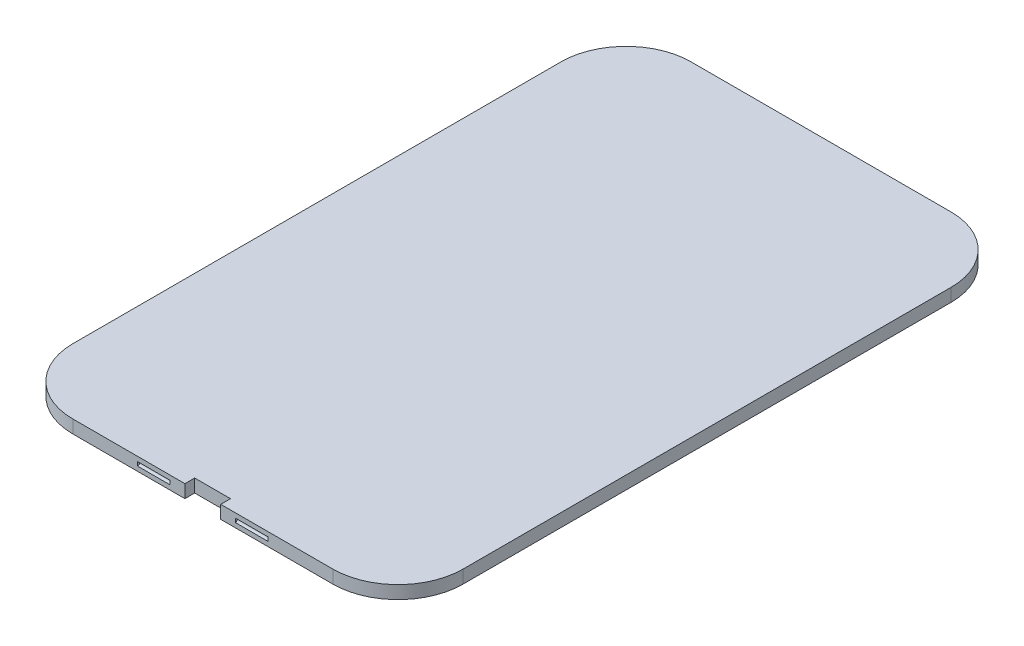
ISO-10303-21;
HEADER;
FILE_DESCRIPTION(('STEP AP214'),'2;1');
FILE_NAME('part.step','',(''),(''),'','','');
FILE_SCHEMA(('AUTOMOTIVE_DESIGN { 1 0 10303 214 1 1 1 1 }'));
ENDSEC;
DATA;
#1=APPLICATION_CONTEXT('core data for automotive mechanical design processes');
#2=APPLICATION_PROTOCOL_DEFINITION('international standard','automotive_design',2000,#1);
#3=PRODUCT_CONTEXT('',#1,'mechanical');
#4=PRODUCT('Part','Part','',(#3));
#5=PRODUCT_RELATED_PRODUCT_CATEGORY('part','',(#4));
#6=PRODUCT_DEFINITION_FORMATION('','',#4);
#7=PRODUCT_DEFINITION_CONTEXT('part definition',#1,'design');
#8=PRODUCT_DEFINITION('design','',#6,#7);
#9=PRODUCT_DEFINITION_SHAPE('','',#8);
#10=(LENGTH_UNIT() NAMED_UNIT(*) SI_UNIT(.MILLI.,.METRE.));
#11=(NAMED_UNIT(*) PLANE_ANGLE_UNIT() SI_UNIT($,.RADIAN.));
#12=(NAMED_UNIT(*) SI_UNIT($,.STERADIAN.) SOLID_ANGLE_UNIT());
#13=UNCERTAINTY_MEASURE_WITH_UNIT(LENGTH_MEASURE(1.E-05),#10,'distance_accuracy_value','');
#14=(GEOMETRIC_REPRESENTATION_CONTEXT(3) GLOBAL_UNCERTAINTY_ASSIGNED_CONTEXT((#13)) GLOBAL_UNIT_ASSIGNED_CONTEXT((#10,
#11,#12)) REPRESENTATION_CONTEXT('',''));
#15=CARTESIAN_POINT('',(0.,0.,0.));
#16=DIRECTION('',(0.,0.,1.));
#17=DIRECTION('',(1.,0.,0.));
#18=AXIS2_PLACEMENT_3D('',#15,#16,#17);
#19=CARTESIAN_POINT('',(-25.3365,2.54,60.2615));
#20=DIRECTION('',(0.,0.,-1.));
#21=DIRECTION('',(-1.,0.,0.));
#22=AXIS2_PLACEMENT_3D('',#19,#20,#21);
#23=PLANE('',#22);
#24=DIRECTION('',(1.,0.,0.));
#25=VECTOR('',#24,1.);
#26=CARTESIAN_POINT('',(-12.7,0.888999999999998,60.2615));
#27=LINE('',#26,#25);
#28=CARTESIAN_POINT('',(-12.7,0.888999999999998,60.2615));
#29=VERTEX_POINT('',#28);
#30=CARTESIAN_POINT('',(-6.35,0.889,60.2615));
#31=VERTEX_POINT('',#30);
#32=EDGE_CURVE('E263',#29,#31,#27,.T.);
#33=ORIENTED_EDGE('',*,*,#32,.F.);
#34=DIRECTION('',(0.,-1.,0.));
#35=VECTOR('',#34,1.);
#36=CARTESIAN_POINT('',(-12.7,1.651,60.2615));
#37=LINE('',#36,#35);
#38=CARTESIAN_POINT('',(-12.7,1.651,60.2615));
#39=VERTEX_POINT('',#38);
#40=EDGE_CURVE('E258',#39,#29,#37,.T.);
#41=ORIENTED_EDGE('',*,*,#40,.F.);
#42=DIRECTION('',(-1.,0.,0.));
#43=VECTOR('',#42,1.);
#44=CARTESIAN_POINT('',(-12.7,1.651,60.2615));
#45=LINE('',#44,#43);
#46=CARTESIAN_POINT('',(-6.35,1.651,60.2615));
#47=VERTEX_POINT('',#46);
#48=EDGE_CURVE('E255',#47,#39,#45,.T.);
#49=ORIENTED_EDGE('',*,*,#48,.F.);
#50=DIRECTION('',(0.,1.,0.));
#51=VECTOR('',#50,1.);
#52=CARTESIAN_POINT('',(-6.35,1.651,60.2615));
#53=LINE('',#52,#51);
#54=EDGE_CURVE('E265',#31,#47,#53,.T.);
#55=ORIENTED_EDGE('',*,*,#54,.F.);
#56=EDGE_LOOP('',(#33,#41,#49,#55));
#57=FACE_BOUND('',#56,.T.);
#58=DIRECTION('',(1.,0.,0.));
#59=VECTOR('',#58,1.);
#60=CARTESIAN_POINT('',(-25.3365,0.,60.2615));
#61=LINE('',#60,#59);
#62=CARTESIAN_POINT('',(-25.3365,0.,60.2615));
#63=VERTEX_POINT('',#62);
#64=CARTESIAN_POINT('',(-3.4925,0.,60.2615));
#65=VERTEX_POINT('',#64);
#66=EDGE_CURVE('E392',#63,#65,#61,.T.);
#67=ORIENTED_EDGE('',*,*,#66,.T.);
#68=DIRECTION('',(0.,1.,0.));
#69=VECTOR('',#68,1.);
#70=CARTESIAN_POINT('',(-3.4925,0.,60.2615));
#71=LINE('',#70,#69);
#72=CARTESIAN_POINT('',(-3.4925,2.54,60.2615));
#73=VERTEX_POINT('',#72);
#74=EDGE_CURVE('E282',#65,#73,#71,.T.);
#75=ORIENTED_EDGE('',*,*,#74,.T.);
#76=DIRECTION('',(1.,0.,0.));
#77=VECTOR('',#76,1.);
#78=CARTESIAN_POINT('',(-25.3365,2.54,60.2615));
#79=LINE('',#78,#77);
#80=CARTESIAN_POINT('',(-25.3365,2.54,60.2615));
#81=VERTEX_POINT('',#80);
#82=EDGE_CURVE('E373',#81,#73,#79,.T.);
#83=ORIENTED_EDGE('',*,*,#82,.F.);
#84=DIRECTION('',(0.,-1.,0.));
#85=VECTOR('',#84,1.);
#86=CARTESIAN_POINT('',(-25.3365,2.54,60.2615));
#87=LINE('',#86,#85);
#88=EDGE_CURVE('E419',#81,#63,#87,.T.);
#89=ORIENTED_EDGE('',*,*,#88,.T.);
#90=EDGE_LOOP('',(#67,#75,#83,#89));
#91=FACE_BOUND('',#90,.T.);
#92=ADVANCED_FACE('F32',(#57,#91),#23,.F.);
#93=CARTESIAN_POINT('',(-25.3365,2.54,-60.2615));
#94=DIRECTION('',(0.,0.,1.));
#95=DIRECTION('',(1.,0.,0.));
#96=AXIS2_PLACEMENT_3D('',#93,#94,#95);
#97=PLANE('',#96);
#98=DIRECTION('',(0.,1.,0.));
#99=VECTOR('',#98,1.);
#100=CARTESIAN_POINT('',(-18.923,0.,-60.2615));
#101=LINE('',#100,#99);
#102=CARTESIAN_POINT('',(-18.923,0.,-60.2615));
#103=VERTEX_POINT('',#102);
#104=CARTESIAN_POINT('',(-18.923,1.27,-60.2615));
#105=VERTEX_POINT('',#104);
#106=EDGE_CURVE('E291',#103,#105,#101,.T.);
#107=ORIENTED_EDGE('',*,*,#106,.F.);
#108=DIRECTION('',(-1.,0.,0.));
#109=VECTOR('',#108,1.);
#110=CARTESIAN_POINT('',(-25.3365,0.,-60.2615));
#111=LINE('',#110,#109);
#112=CARTESIAN_POINT('',(-25.3365,0.,-60.2615));
#113=VERTEX_POINT('',#112);
#114=EDGE_CURVE('E401',#103,#113,#111,.T.);
#115=ORIENTED_EDGE('',*,*,#114,.T.);
#116=DIRECTION('',(0.,-1.,0.));
#117=VECTOR('',#116,1.);
#118=CARTESIAN_POINT('',(-25.3365,2.54,-60.2615));
#119=LINE('',#118,#117);
#120=CARTESIAN_POINT('',(-25.3365,2.54,-60.2615));
#121=VERTEX_POINT('',#120);
#122=EDGE_CURVE('E384',#121,#113,#119,.T.);
#123=ORIENTED_EDGE('',*,*,#122,.F.);
#124=DIRECTION('',(-1.,0.,0.));
#125=VECTOR('',#124,1.);
#126=CARTESIAN_POINT('',(-25.3365,2.54,-60.2615));
#127=LINE('',#126,#125);
#128=CARTESIAN_POINT('',(25.3365,2.54,-60.2615));
#129=VERTEX_POINT('',#128);
#130=EDGE_CURVE('E382',#129,#121,#127,.T.);
#131=ORIENTED_EDGE('',*,*,#130,.F.);
#132=DIRECTION('',(0.,-1.,0.));
#133=VECTOR('',#132,1.);
#134=CARTESIAN_POINT('',(25.3365,2.54,-60.2615));
#135=LINE('',#134,#133);
#136=CARTESIAN_POINT('',(25.3365,0.,-60.2615));
#137=VERTEX_POINT('',#136);
#138=EDGE_CURVE('E407',#129,#137,#135,.T.);
#139=ORIENTED_EDGE('',*,*,#138,.T.);
#140=CARTESIAN_POINT('',(18.923,0.,-60.2615));
#141=VERTEX_POINT('',#140);
#142=EDGE_CURVE('E368',#137,#141,#111,.T.);
#143=ORIENTED_EDGE('',*,*,#142,.T.);
#144=DIRECTION('',(0.,-1.,0.));
#145=VECTOR('',#144,1.);
#146=CARTESIAN_POINT('',(18.923,0.,-60.2615));
#147=LINE('',#146,#145);
#148=CARTESIAN_POINT('',(18.923,1.27,-60.2615));
#149=VERTEX_POINT('',#148);
#150=EDGE_CURVE('E313',#149,#141,#147,.T.);
#151=ORIENTED_EDGE('',*,*,#150,.F.);
#152=DIRECTION('',(1.,0.,0.));
#153=VECTOR('',#152,1.);
#154=CARTESIAN_POINT('',(18.923,1.27,-60.2615));
#155=LINE('',#154,#153);
#156=CARTESIAN_POINT('',(6.477,1.27,-60.2615));
#157=VERTEX_POINT('',#156);
#158=EDGE_CURVE('E339',#157,#149,#155,.T.);
#159=ORIENTED_EDGE('',*,*,#158,.F.);
#160=DIRECTION('',(0.,1.,0.));
#161=VECTOR('',#160,1.);
#162=CARTESIAN_POINT('',(6.477,0.,-60.2615));
#163=LINE('',#162,#161);
#164=CARTESIAN_POINT('',(6.477,0.,-60.2615));
#165=VERTEX_POINT('',#164);
#166=EDGE_CURVE('E336',#165,#157,#163,.T.);
#167=ORIENTED_EDGE('',*,*,#166,.F.);
#168=CARTESIAN_POINT('',(-6.47700000000001,0.,-60.2615));
#169=VERTEX_POINT('',#168);
#170=EDGE_CURVE('E404',#165,#169,#111,.T.);
#171=ORIENTED_EDGE('',*,*,#170,.T.);
#172=DIRECTION('',(0.,-1.,0.));
#173=VECTOR('',#172,1.);
#174=CARTESIAN_POINT('',(-6.477,0.,-60.2615));
#175=LINE('',#174,#173);
#176=CARTESIAN_POINT('',(-6.477,1.27,-60.2615));
#177=VERTEX_POINT('',#176);
#178=EDGE_CURVE('E303',#177,#169,#175,.T.);
#179=ORIENTED_EDGE('',*,*,#178,.F.);
#180=DIRECTION('',(1.,0.,0.));
#181=VECTOR('',#180,1.);
#182=CARTESIAN_POINT('',(-18.923,1.27,-60.2615));
#183=LINE('',#182,#181);
#184=EDGE_CURVE('E300',#105,#177,#183,.T.);
#185=ORIENTED_EDGE('',*,*,#184,.F.);
#186=EDGE_LOOP('',(#107,#115,#123,#131,#139,#143,#151,#159,#167,#171,#179,#185));
#187=FACE_BOUND('',#186,.T.);
#188=ADVANCED_FACE('F448',(#187),#97,.F.);
#189=CARTESIAN_POINT('',(-25.3365,2.54,-47.5615));
#190=DIRECTION('',(0.,-1.,0.));
#191=DIRECTION('',(0.,0.,-1.));
#192=AXIS2_PLACEMENT_3D('',#189,#190,#191);
#193=CYLINDRICAL_SURFACE('',#192,12.7);
#194=CARTESIAN_POINT('',(-25.3365,0.,-47.5615));
#195=DIRECTION('',(0.,1.,0.));
#196=DIRECTION('',(0.,0.,-1.));
#197=AXIS2_PLACEMENT_3D('',#194,#195,#196);
#198=CIRCLE('',#197,12.7);
#199=CARTESIAN_POINT('',(-38.0365,0.,-47.5615));
#200=VERTEX_POINT('',#199);
#201=EDGE_CURVE('E346',#113,#200,#198,.T.);
#202=ORIENTED_EDGE('',*,*,#201,.T.);
#203=DIRECTION('',(0.,-1.,0.));
#204=VECTOR('',#203,1.);
#205=CARTESIAN_POINT('',(-38.0365,2.54,-47.5615));
#206=LINE('',#205,#204);
#207=CARTESIAN_POINT('',(-38.0365,2.54,-47.5615));
#208=VERTEX_POINT('',#207);
#209=EDGE_CURVE('E230',#208,#200,#206,.T.);
#210=ORIENTED_EDGE('',*,*,#209,.F.);
#211=CARTESIAN_POINT('',(-25.3365,2.54,-47.5615));
#212=DIRECTION('',(0.,1.,0.));
#213=DIRECTION('',(0.,0.,-1.));
#214=AXIS2_PLACEMENT_3D('',#211,#212,#213);
#215=CIRCLE('',#214,12.7);
#216=EDGE_CURVE('E364',#121,#208,#215,.T.);
#217=ORIENTED_EDGE('',*,*,#216,.F.);
#218=ORIENTED_EDGE('',*,*,#122,.T.);
#219=EDGE_LOOP('',(#202,#210,#217,#218));
#220=FACE_BOUND('',#219,.T.);
#221=ADVANCED_FACE('F443',(#220),#193,.T.);
#222=CARTESIAN_POINT('',(-38.0365,2.54,47.5615));
#223=DIRECTION('',(1.,0.,0.));
#224=DIRECTION('',(0.,0.,-1.));
#225=AXIS2_PLACEMENT_3D('',#222,#223,#224);
#226=PLANE('',#225);
#227=DIRECTION('',(0.,0.,1.));
#228=VECTOR('',#227,1.);
#229=CARTESIAN_POINT('',(-38.0365,0.,47.5615));
#230=LINE('',#229,#228);
#231=CARTESIAN_POINT('',(-38.0365,0.,47.5615));
#232=VERTEX_POINT('',#231);
#233=EDGE_CURVE('E387',#200,#232,#230,.T.);
#234=ORIENTED_EDGE('',*,*,#233,.T.);
#235=DIRECTION('',(0.,-1.,0.));
#236=VECTOR('',#235,1.);
#237=CARTESIAN_POINT('',(-38.0365,2.54,47.5615));
#238=LINE('',#237,#236);
#239=CARTESIAN_POINT('',(-38.0365,2.54,47.5615));
#240=VERTEX_POINT('',#239);
#241=EDGE_CURVE('E235',#240,#232,#238,.T.);
#242=ORIENTED_EDGE('',*,*,#241,.F.);
#243=DIRECTION('',(0.,0.,1.));
#244=VECTOR('',#243,1.);
#245=CARTESIAN_POINT('',(-38.0365,2.54,47.5615));
#246=LINE('',#245,#244);
#247=EDGE_CURVE('E367',#208,#240,#246,.T.);
#248=ORIENTED_EDGE('',*,*,#247,.F.);
#249=ORIENTED_EDGE('',*,*,#209,.T.);
#250=EDGE_LOOP('',(#234,#242,#248,#249));
#251=FACE_BOUND('',#250,.T.);
#252=ADVANCED_FACE('F441',(#251),#226,.F.);
#253=CARTESIAN_POINT('',(-25.3365,2.54,47.5615));
#254=DIRECTION('',(0.,-1.,0.));
#255=DIRECTION('',(0.,0.,-1.));
#256=AXIS2_PLACEMENT_3D('',#253,#254,#255);
#257=CYLINDRICAL_SURFACE('',#256,12.7);
#258=CARTESIAN_POINT('',(-25.3365,0.,47.5615));
#259=DIRECTION('',(0.,1.,0.));
#260=DIRECTION('',(0.,0.,1.));
#261=AXIS2_PLACEMENT_3D('',#258,#259,#260);
#262=CIRCLE('',#261,12.7);
#263=EDGE_CURVE('E389',#232,#63,#262,.T.);
#264=ORIENTED_EDGE('',*,*,#263,.T.);
#265=ORIENTED_EDGE('',*,*,#88,.F.);
#266=CARTESIAN_POINT('',(-25.3365,2.54,47.5615));
#267=DIRECTION('',(0.,1.,0.));
#268=DIRECTION('',(0.,0.,1.));
#269=AXIS2_PLACEMENT_3D('',#266,#267,#268);
#270=CIRCLE('',#269,12.7);
#271=EDGE_CURVE('E370',#240,#81,#270,.T.);
#272=ORIENTED_EDGE('',*,*,#271,.F.);
#273=ORIENTED_EDGE('',*,*,#241,.T.);
#274=EDGE_LOOP('',(#264,#265,#272,#273));
#275=FACE_BOUND('',#274,.T.);
#276=ADVANCED_FACE('F426',(#275),#257,.T.);
#277=DIRECTION('',(0.,-1.,0.));
#278=VECTOR('',#277,1.);
#279=CARTESIAN_POINT('',(6.35,1.651,60.2615));
#280=LINE('',#279,#278);
#281=CARTESIAN_POINT('',(6.35,1.651,60.2615));
#282=VERTEX_POINT('',#281);
#283=CARTESIAN_POINT('',(6.35,0.889000000000003,60.2615));
#284=VERTEX_POINT('',#283);
#285=EDGE_CURVE('E204',#282,#284,#280,.T.);
#286=ORIENTED_EDGE('',*,*,#285,.F.);
#287=DIRECTION('',(-1.,0.,0.));
#288=VECTOR('',#287,1.);
#289=CARTESIAN_POINT('',(12.7,1.651,60.2615));
#290=LINE('',#289,#288);
#291=CARTESIAN_POINT('',(12.7,1.651,60.2615));
#292=VERTEX_POINT('',#291);
#293=EDGE_CURVE('E216',#292,#282,#290,.T.);
#294=ORIENTED_EDGE('',*,*,#293,.F.);
#295=DIRECTION('',(0.,1.,0.));
#296=VECTOR('',#295,1.);
#297=CARTESIAN_POINT('',(12.7,1.651,60.2615));
#298=LINE('',#297,#296);
#299=CARTESIAN_POINT('',(12.7,0.889000000000004,60.2615));
#300=VERTEX_POINT('',#299);
#301=EDGE_CURVE('E223',#300,#292,#298,.T.);
#302=ORIENTED_EDGE('',*,*,#301,.F.);
#303=DIRECTION('',(1.,0.,0.));
#304=VECTOR('',#303,1.);
#305=CARTESIAN_POINT('',(12.7,0.889000000000004,60.2615));
#306=LINE('',#305,#304);
#307=EDGE_CURVE('E215',#284,#300,#306,.T.);
#308=ORIENTED_EDGE('',*,*,#307,.F.);
#309=EDGE_LOOP('',(#286,#294,#302,#308));
#310=FACE_BOUND('',#309,.T.);
#311=CARTESIAN_POINT('',(3.4925,2.54,60.2615));
#312=VERTEX_POINT('',#311);
#313=CARTESIAN_POINT('',(25.3365,2.54,60.2615));
#314=VERTEX_POINT('',#313);
#315=EDGE_CURVE('E372',#312,#314,#79,.T.);
#316=ORIENTED_EDGE('',*,*,#315,.F.);
#317=DIRECTION('',(0.,1.,0.));
#318=VECTOR('',#317,1.);
#319=CARTESIAN_POINT('',(3.4925,0.,60.2615));
#320=LINE('',#319,#318);
#321=CARTESIAN_POINT('',(3.4925,0.,60.2615));
#322=VERTEX_POINT('',#321);
#323=EDGE_CURVE('E294',#322,#312,#320,.T.);
#324=ORIENTED_EDGE('',*,*,#323,.F.);
#325=CARTESIAN_POINT('',(25.3365,0.,60.2615));
#326=VERTEX_POINT('',#325);
#327=EDGE_CURVE('E391',#322,#326,#61,.T.);
#328=ORIENTED_EDGE('',*,*,#327,.T.);
#329=DIRECTION('',(0.,-1.,0.));
#330=VECTOR('',#329,1.);
#331=CARTESIAN_POINT('',(25.3365,2.54,60.2615));
#332=LINE('',#331,#330);
#333=EDGE_CURVE('E416',#314,#326,#332,.T.);
#334=ORIENTED_EDGE('',*,*,#333,.F.);
#335=EDGE_LOOP('',(#316,#324,#328,#334));
#336=FACE_BOUND('',#335,.T.);
#337=ADVANCED_FACE('F220',(#310,#336),#23,.F.);
#338=CARTESIAN_POINT('',(25.3365,2.54,47.5615));
#339=DIRECTION('',(0.,-1.,0.));
#340=DIRECTION('',(0.,0.,-1.));
#341=AXIS2_PLACEMENT_3D('',#338,#339,#340);
#342=CYLINDRICAL_SURFACE('',#341,12.7);
#343=CARTESIAN_POINT('',(25.3365,0.,47.5615));
#344=DIRECTION('',(0.,1.,0.));
#345=DIRECTION('',(0.,0.,1.));
#346=AXIS2_PLACEMENT_3D('',#343,#344,#345);
#347=CIRCLE('',#346,12.7);
#348=CARTESIAN_POINT('',(38.0365,0.,47.5615));
#349=VERTEX_POINT('',#348);
#350=EDGE_CURVE('E395',#326,#349,#347,.T.);
#351=ORIENTED_EDGE('',*,*,#350,.T.);
#352=DIRECTION('',(0.,-1.,0.));
#353=VECTOR('',#352,1.);
#354=CARTESIAN_POINT('',(38.0365,2.54,47.5615));
#355=LINE('',#354,#353);
#356=CARTESIAN_POINT('',(38.0365,2.54,47.5615));
#357=VERTEX_POINT('',#356);
#358=EDGE_CURVE('E413',#357,#349,#355,.T.);
#359=ORIENTED_EDGE('',*,*,#358,.F.);
#360=CARTESIAN_POINT('',(25.3365,2.54,47.5615));
#361=DIRECTION('',(0.,1.,0.));
#362=DIRECTION('',(0.,0.,1.));
#363=AXIS2_PLACEMENT_3D('',#360,#361,#362);
#364=CIRCLE('',#363,12.7);
#365=EDGE_CURVE('E376',#314,#357,#364,.T.);
#366=ORIENTED_EDGE('',*,*,#365,.F.);
#367=ORIENTED_EDGE('',*,*,#333,.T.);
#368=EDGE_LOOP('',(#351,#359,#366,#367));
#369=FACE_BOUND('',#368,.T.);
#370=ADVANCED_FACE('F486',(#369),#342,.T.);
#371=CARTESIAN_POINT('',(38.0365,2.54,47.5615));
#372=DIRECTION('',(-1.,0.,0.));
#373=DIRECTION('',(0.,0.,1.));
#374=AXIS2_PLACEMENT_3D('',#371,#372,#373);
#375=PLANE('',#374);
#376=DIRECTION('',(0.,0.,-1.));
#377=VECTOR('',#376,1.);
#378=CARTESIAN_POINT('',(38.0365,0.,47.5615));
#379=LINE('',#378,#377);
#380=CARTESIAN_POINT('',(38.0365,0.,-47.5615));
#381=VERTEX_POINT('',#380);
#382=EDGE_CURVE('E397',#349,#381,#379,.T.);
#383=ORIENTED_EDGE('',*,*,#382,.T.);
#384=DIRECTION('',(0.,-1.,0.));
#385=VECTOR('',#384,1.);
#386=CARTESIAN_POINT('',(38.0365,2.54,-47.5615));
#387=LINE('',#386,#385);
#388=CARTESIAN_POINT('',(38.0365,2.54,-47.5615));
#389=VERTEX_POINT('',#388);
#390=EDGE_CURVE('E410',#389,#381,#387,.T.);
#391=ORIENTED_EDGE('',*,*,#390,.F.);
#392=DIRECTION('',(0.,0.,-1.));
#393=VECTOR('',#392,1.);
#394=CARTESIAN_POINT('',(38.0365,2.54,47.5615));
#395=LINE('',#394,#393);
#396=EDGE_CURVE('E378',#357,#389,#395,.T.);
#397=ORIENTED_EDGE('',*,*,#396,.F.);
#398=ORIENTED_EDGE('',*,*,#358,.T.);
#399=EDGE_LOOP('',(#383,#391,#397,#398));
#400=FACE_BOUND('',#399,.T.);
#401=ADVANCED_FACE('F491',(#400),#375,.F.);
#402=CARTESIAN_POINT('',(25.3365,2.54,-47.5615));
#403=DIRECTION('',(0.,-1.,0.));
#404=DIRECTION('',(0.,0.,-1.));
#405=AXIS2_PLACEMENT_3D('',#402,#403,#404);
#406=CYLINDRICAL_SURFACE('',#405,12.7);
#407=CARTESIAN_POINT('',(25.3365,0.,-47.5615));
#408=DIRECTION('',(0.,1.,0.));
#409=DIRECTION('',(0.,0.,1.));
#410=AXIS2_PLACEMENT_3D('',#407,#408,#409);
#411=CIRCLE('',#410,12.7);
#412=EDGE_CURVE('E399',#381,#137,#411,.T.);
#413=ORIENTED_EDGE('',*,*,#412,.T.);
#414=ORIENTED_EDGE('',*,*,#138,.F.);
#415=CARTESIAN_POINT('',(25.3365,2.54,-47.5615));
#416=DIRECTION('',(0.,1.,0.));
#417=DIRECTION('',(0.,0.,1.));
#418=AXIS2_PLACEMENT_3D('',#415,#416,#417);
#419=CIRCLE('',#418,12.7);
#420=EDGE_CURVE('E380',#389,#129,#419,.T.);
#421=ORIENTED_EDGE('',*,*,#420,.F.);
#422=ORIENTED_EDGE('',*,*,#390,.T.);
#423=EDGE_LOOP('',(#413,#414,#421,#422));
#424=FACE_BOUND('',#423,.T.);
#425=ADVANCED_FACE('F658',(#424),#406,.T.);
#426=CARTESIAN_POINT('',(-25.3365,2.54,-47.5615));
#427=DIRECTION('',(0.,-1.,0.));
#428=DIRECTION('',(0.,0.,-1.));
#429=AXIS2_PLACEMENT_3D('',#426,#427,#428);
#430=PLANE('',#429);
#431=ORIENTED_EDGE('',*,*,#82,.T.);
#432=DIRECTION('',(0.,0.,1.));
#433=VECTOR('',#432,1.);
#434=CARTESIAN_POINT('',(-3.4925,2.54,60.2615));
#435=LINE('',#434,#433);
#436=CARTESIAN_POINT('',(-3.4925,2.54,58.3565));
#437=VERTEX_POINT('',#436);
#438=EDGE_CURVE('E271',#437,#73,#435,.T.);
#439=ORIENTED_EDGE('',*,*,#438,.F.);
#440=DIRECTION('',(-1.,0.,0.));
#441=VECTOR('',#440,1.);
#442=CARTESIAN_POINT('',(-3.4925,2.54,58.3565));
#443=LINE('',#442,#441);
#444=CARTESIAN_POINT('',(3.4925,2.54,58.3565));
#445=VERTEX_POINT('',#444);
#446=EDGE_CURVE('E276',#445,#437,#443,.T.);
#447=ORIENTED_EDGE('',*,*,#446,.F.);
#448=DIRECTION('',(0.,0.,-1.));
#449=VECTOR('',#448,1.);
#450=CARTESIAN_POINT('',(3.4925,2.54,60.2615));
#451=LINE('',#450,#449);
#452=EDGE_CURVE('E284',#312,#445,#451,.T.);
#453=ORIENTED_EDGE('',*,*,#452,.F.);
#454=ORIENTED_EDGE('',*,*,#315,.T.);
#455=ORIENTED_EDGE('',*,*,#365,.T.);
#456=ORIENTED_EDGE('',*,*,#396,.T.);
#457=ORIENTED_EDGE('',*,*,#420,.T.);
#458=ORIENTED_EDGE('',*,*,#130,.T.);
#459=ORIENTED_EDGE('',*,*,#216,.T.);
#460=ORIENTED_EDGE('',*,*,#247,.T.);
#461=ORIENTED_EDGE('',*,*,#271,.T.);
#462=EDGE_LOOP('',(#431,#439,#447,#453,#454,#455,#456,#457,#458,#459,#460,#461));
#463=FACE_BOUND('',#462,.T.);
#464=ADVANCED_FACE('F437',(#463),#430,.F.);
#465=CARTESIAN_POINT('',(-25.3365,0.,-47.5615));
#466=DIRECTION('',(0.,-1.,0.));
#467=DIRECTION('',(0.,0.,-1.));
#468=AXIS2_PLACEMENT_3D('',#465,#466,#467);
#469=PLANE('',#468);
#470=DIRECTION('',(0.,0.,1.));
#471=VECTOR('',#470,1.);
#472=CARTESIAN_POINT('',(-3.4925,0.,60.2615));
#473=LINE('',#472,#471);
#474=CARTESIAN_POINT('',(-3.4925,0.,58.3565));
#475=VERTEX_POINT('',#474);
#476=EDGE_CURVE('E272',#475,#65,#473,.T.);
#477=ORIENTED_EDGE('',*,*,#476,.T.);
#478=ORIENTED_EDGE('',*,*,#66,.F.);
#479=ORIENTED_EDGE('',*,*,#263,.F.);
#480=ORIENTED_EDGE('',*,*,#233,.F.);
#481=ORIENTED_EDGE('',*,*,#201,.F.);
#482=ORIENTED_EDGE('',*,*,#114,.F.);
#483=DIRECTION('',(-1.,0.,0.));
#484=VECTOR('',#483,1.);
#485=CARTESIAN_POINT('',(-18.923,0.,-60.2615));
#486=LINE('',#485,#484);
#487=EDGE_CURVE('E306',#169,#103,#486,.T.);
#488=ORIENTED_EDGE('',*,*,#487,.F.);
#489=ORIENTED_EDGE('',*,*,#170,.F.);
#490=DIRECTION('',(-1.,0.,0.));
#491=VECTOR('',#490,1.);
#492=CARTESIAN_POINT('',(18.923,0.,-60.2615));
#493=LINE('',#492,#491);
#494=EDGE_CURVE('E333',#141,#165,#493,.T.);
#495=ORIENTED_EDGE('',*,*,#494,.F.);
#496=ORIENTED_EDGE('',*,*,#142,.F.);
#497=ORIENTED_EDGE('',*,*,#412,.F.);
#498=ORIENTED_EDGE('',*,*,#382,.F.);
#499=ORIENTED_EDGE('',*,*,#350,.F.);
#500=ORIENTED_EDGE('',*,*,#327,.F.);
#501=DIRECTION('',(0.,0.,-1.));
#502=VECTOR('',#501,1.);
#503=CARTESIAN_POINT('',(3.4925,0.,60.2615));
#504=LINE('',#503,#502);
#505=CARTESIAN_POINT('',(3.4925,0.,58.3565));
#506=VERTEX_POINT('',#505);
#507=EDGE_CURVE('E275',#322,#506,#504,.T.);
#508=ORIENTED_EDGE('',*,*,#507,.T.);
#509=DIRECTION('',(-1.,0.,0.));
#510=VECTOR('',#509,1.);
#511=CARTESIAN_POINT('',(-3.4925,0.,58.3565));
#512=LINE('',#511,#510);
#513=EDGE_CURVE('E279',#506,#475,#512,.T.);
#514=ORIENTED_EDGE('',*,*,#513,.T.);
#515=EDGE_LOOP('',(#477,#478,#479,#480,#481,#482,#488,#489,#495,#496,#497,#498,#499,#500,#508,#514));
#516=FACE_BOUND('',#515,.T.);
#517=ADVANCED_FACE('F431',(#516),#469,.T.);
#518=CARTESIAN_POINT('',(18.923,0.,-60.2615));
#519=DIRECTION('',(0.992546151641322,0.,-0.121869343405148));
#520=DIRECTION('',(-0.121869343405148,0.,-0.992546151641322));
#521=AXIS2_PLACEMENT_3D('',#518,#519,#520);
#522=PLANE('',#521);
#523=ORIENTED_EDGE('',*,*,#150,.T.);
#524=DIRECTION('',(0.120974291151355,-0.120974291151355,0.985256536015293));
#525=VECTOR('',#524,1.);
#526=CARTESIAN_POINT('',(18.923,0.,-60.2615));
#527=LINE('',#526,#525);
#528=CARTESIAN_POINT('',(18.7670636076533,0.155936392346689,-61.5315));
#529=VERTEX_POINT('',#528);
#530=EDGE_CURVE('E343',#529,#141,#527,.T.);
#531=ORIENTED_EDGE('',*,*,#530,.F.);
#532=DIRECTION('',(0.,1.,0.));
#533=VECTOR('',#532,1.);
#534=CARTESIAN_POINT('',(18.7670636076533,0.,-61.5315));
#535=LINE('',#534,#533);
#536=CARTESIAN_POINT('',(18.7670636076533,1.11406360765331,-61.5315));
#537=VERTEX_POINT('',#536);
#538=EDGE_CURVE('E342',#537,#529,#535,.F.);
#539=ORIENTED_EDGE('',*,*,#538,.F.);
#540=DIRECTION('',(0.120974291151355,0.120974291151355,0.985256536015293));
#541=VECTOR('',#540,1.);
#542=CARTESIAN_POINT('',(18.9044138305181,1.25141383051814,-60.4128722030293));
#543=LINE('',#542,#541);
#544=EDGE_CURVE('E348',#537,#149,#543,.T.);
#545=ORIENTED_EDGE('',*,*,#544,.T.);
#546=EDGE_LOOP('',(#523,#531,#539,#545));
#547=FACE_BOUND('',#546,.T.);
#548=ADVANCED_FACE('F635',(#547),#522,.T.);
#549=CARTESIAN_POINT('',(18.923,0.,-60.2615));
#550=DIRECTION('',(0.,-0.992546151641322,-0.121869343405148));
#551=DIRECTION('',(0.,0.121869343405148,-0.992546151641322));
#552=AXIS2_PLACEMENT_3D('',#549,#550,#551);
#553=PLANE('',#552);
#554=ORIENTED_EDGE('',*,*,#494,.T.);
#555=DIRECTION('',(-0.120974291151355,-0.120974291151355,0.985256536015293));
#556=VECTOR('',#555,1.);
#557=CARTESIAN_POINT('',(6.477,0.,-60.2615));
#558=LINE('',#557,#556);
#559=CARTESIAN_POINT('',(6.63293639234669,0.155936392346689,-61.5315));
#560=VERTEX_POINT('',#559);
#561=EDGE_CURVE('E347',#560,#165,#558,.T.);
#562=ORIENTED_EDGE('',*,*,#561,.F.);
#563=DIRECTION('',(1.,0.,0.));
#564=VECTOR('',#563,1.);
#565=CARTESIAN_POINT('',(0.,0.155936392346689,-61.5315));
#566=LINE('',#565,#564);
#567=EDGE_CURVE('E359',#529,#560,#566,.F.);
#568=ORIENTED_EDGE('',*,*,#567,.F.);
#569=ORIENTED_EDGE('',*,*,#530,.T.);
#570=EDGE_LOOP('',(#554,#562,#568,#569));
#571=FACE_BOUND('',#570,.T.);
#572=ADVANCED_FACE('F625',(#571),#553,.T.);
#573=CARTESIAN_POINT('',(6.477,0.,-60.2615));
#574=DIRECTION('',(-0.992546151641322,0.,-0.121869343405148));
#575=DIRECTION('',(-0.121869343405148,0.,0.992546151641322));
#576=AXIS2_PLACEMENT_3D('',#573,#574,#575);
#577=PLANE('',#576);
#578=ORIENTED_EDGE('',*,*,#166,.T.);
#579=DIRECTION('',(-0.120974291151355,0.120974291151355,0.985256536015293));
#580=VECTOR('',#579,1.);
#581=CARTESIAN_POINT('',(6.6591444609222,1.0878555390778,-61.7449475896871));
#582=LINE('',#581,#580);
#583=CARTESIAN_POINT('',(6.63293639234669,1.11406360765331,-61.5315));
#584=VERTEX_POINT('',#583);
#585=EDGE_CURVE('E351',#584,#157,#582,.T.);
#586=ORIENTED_EDGE('',*,*,#585,.F.);
#587=DIRECTION('',(0.,-1.,0.));
#588=VECTOR('',#587,1.);
#589=CARTESIAN_POINT('',(6.63293639234669,0.,-61.5315));
#590=LINE('',#589,#588);
#591=EDGE_CURVE('E361',#560,#584,#590,.F.);
#592=ORIENTED_EDGE('',*,*,#591,.F.);
#593=ORIENTED_EDGE('',*,*,#561,.T.);
#594=EDGE_LOOP('',(#578,#586,#592,#593));
#595=FACE_BOUND('',#594,.T.);
#596=ADVANCED_FACE('F615',(#595),#577,.T.);
#597=CARTESIAN_POINT('',(18.923,1.27,-60.2615));
#598=DIRECTION('',(0.,0.992546151641322,-0.121869343405148));
#599=DIRECTION('',(0.,0.121869343405148,0.992546151641322));
#600=AXIS2_PLACEMENT_3D('',#597,#598,#599);
#601=PLANE('',#600);
#602=ORIENTED_EDGE('',*,*,#158,.T.);
#603=ORIENTED_EDGE('',*,*,#544,.F.);
#604=DIRECTION('',(-1.,0.,0.));
#605=VECTOR('',#604,1.);
#606=CARTESIAN_POINT('',(0.,1.11406360765331,-61.5315));
#607=LINE('',#606,#605);
#608=EDGE_CURVE('E352',#584,#537,#607,.F.);
#609=ORIENTED_EDGE('',*,*,#608,.F.);
#610=ORIENTED_EDGE('',*,*,#585,.T.);
#611=EDGE_LOOP('',(#602,#603,#609,#610));
#612=FACE_BOUND('',#611,.T.);
#613=ADVANCED_FACE('F606',(#612),#601,.T.);
#614=CARTESIAN_POINT('',(0.,0.,-61.5315));
#615=DIRECTION('',(0.,0.,1.));
#616=DIRECTION('',(1.,0.,0.));
#617=AXIS2_PLACEMENT_3D('',#614,#615,#616);
#618=PLANE('',#617);
#619=ORIENTED_EDGE('',*,*,#538,.T.);
#620=ORIENTED_EDGE('',*,*,#567,.T.);
#621=ORIENTED_EDGE('',*,*,#591,.T.);
#622=ORIENTED_EDGE('',*,*,#608,.T.);
#623=EDGE_LOOP('',(#619,#620,#621,#622));
#624=FACE_BOUND('',#623,.T.);
#625=ADVANCED_FACE('F474',(#624),#618,.F.);
#626=CARTESIAN_POINT('',(-18.923,0.,-60.2615));
#627=DIRECTION('',(-0.992546151641322,0.,-0.121869343405148));
#628=DIRECTION('',(-0.121869343405148,0.,0.992546151641322));
#629=AXIS2_PLACEMENT_3D('',#626,#627,#628);
#630=PLANE('',#629);
#631=ORIENTED_EDGE('',*,*,#106,.T.);
#632=DIRECTION('',(-0.120974291151355,0.120974291151355,0.985256536015293));
#633=VECTOR('',#632,1.);
#634=CARTESIAN_POINT('',(-18.923,1.27,-60.2615));
#635=LINE('',#634,#633);
#636=CARTESIAN_POINT('',(-18.7670636076533,1.11406360765331,-61.5315));
#637=VERTEX_POINT('',#636);
#638=EDGE_CURVE('E310',#637,#105,#635,.T.);
#639=ORIENTED_EDGE('',*,*,#638,.F.);
#640=DIRECTION('',(0.,-1.,0.));
#641=VECTOR('',#640,1.);
#642=CARTESIAN_POINT('',(-18.7670636076533,0.,-61.5315));
#643=LINE('',#642,#641);
#644=CARTESIAN_POINT('',(-18.7670636076533,0.155936392346689,-61.5315));
#645=VERTEX_POINT('',#644);
#646=EDGE_CURVE('E309',#645,#637,#643,.F.);
#647=ORIENTED_EDGE('',*,*,#646,.F.);
#648=DIRECTION('',(-0.120974291151355,-0.120974291151355,0.985256536015293));
#649=VECTOR('',#648,1.);
#650=CARTESIAN_POINT('',(-18.923,0.,-60.2615));
#651=LINE('',#650,#649);
#652=EDGE_CURVE('E315',#645,#103,#651,.T.);
#653=ORIENTED_EDGE('',*,*,#652,.T.);
#654=EDGE_LOOP('',(#631,#639,#647,#653));
#655=FACE_BOUND('',#654,.T.);
#656=ADVANCED_FACE('F457',(#655),#630,.T.);
#657=CARTESIAN_POINT('',(-18.923,1.27,-60.2615));
#658=DIRECTION('',(0.,0.992546151641322,-0.121869343405148));
#659=DIRECTION('',(0.,0.121869343405148,0.992546151641322));
#660=AXIS2_PLACEMENT_3D('',#657,#658,#659);
#661=PLANE('',#660);
#662=ORIENTED_EDGE('',*,*,#184,.T.);
#663=DIRECTION('',(0.120974291151355,0.120974291151355,0.985256536015293));
#664=VECTOR('',#663,1.);
#665=CARTESIAN_POINT('',(-6.49558616948186,1.25141383051814,-60.4128722030293));
#666=LINE('',#665,#664);
#667=CARTESIAN_POINT('',(-6.63293639234669,1.11406360765331,-61.5315));
#668=VERTEX_POINT('',#667);
#669=EDGE_CURVE('E314',#668,#177,#666,.T.);
#670=ORIENTED_EDGE('',*,*,#669,.F.);
#671=DIRECTION('',(-1.,0.,0.));
#672=VECTOR('',#671,1.);
#673=CARTESIAN_POINT('',(-18.923,1.11406360765331,-61.5315));
#674=LINE('',#673,#672);
#675=EDGE_CURVE('E326',#637,#668,#674,.F.);
#676=ORIENTED_EDGE('',*,*,#675,.F.);
#677=ORIENTED_EDGE('',*,*,#638,.T.);
#678=EDGE_LOOP('',(#662,#670,#676,#677));
#679=FACE_BOUND('',#678,.T.);
#680=ADVANCED_FACE('F466',(#679),#661,.T.);
#681=CARTESIAN_POINT('',(-6.477,0.,-60.2615));
#682=DIRECTION('',(0.992546151641322,0.,-0.121869343405148));
#683=DIRECTION('',(-0.121869343405148,0.,-0.992546151641322));
#684=AXIS2_PLACEMENT_3D('',#681,#682,#683);
#685=PLANE('',#684);
#686=ORIENTED_EDGE('',*,*,#178,.T.);
#687=DIRECTION('',(0.120974291151355,-0.120974291151355,0.985256536015293));
#688=VECTOR('',#687,1.);
#689=CARTESIAN_POINT('',(-6.6591444609222,0.182144460922202,-61.7449475896871));
#690=LINE('',#689,#688);
#691=CARTESIAN_POINT('',(-6.63293639234669,0.155936392346689,-61.5315));
#692=VERTEX_POINT('',#691);
#693=EDGE_CURVE('E318',#692,#169,#690,.T.);
#694=ORIENTED_EDGE('',*,*,#693,.F.);
#695=DIRECTION('',(0.,1.,0.));
#696=VECTOR('',#695,1.);
#697=CARTESIAN_POINT('',(-6.63293639234669,0.,-61.5315));
#698=LINE('',#697,#696);
#699=EDGE_CURVE('E328',#668,#692,#698,.F.);
#700=ORIENTED_EDGE('',*,*,#699,.F.);
#701=ORIENTED_EDGE('',*,*,#669,.T.);
#702=EDGE_LOOP('',(#686,#694,#700,#701));
#703=FACE_BOUND('',#702,.T.);
#704=ADVANCED_FACE('F463',(#703),#685,.T.);
#705=CARTESIAN_POINT('',(-18.923,0.,-60.2615));
#706=DIRECTION('',(0.,-0.992546151641322,-0.121869343405148));
#707=DIRECTION('',(0.,0.121869343405148,-0.992546151641322));
#708=AXIS2_PLACEMENT_3D('',#705,#706,#707);
#709=PLANE('',#708);
#710=ORIENTED_EDGE('',*,*,#487,.T.);
#711=ORIENTED_EDGE('',*,*,#652,.F.);
#712=DIRECTION('',(1.,0.,0.));
#713=VECTOR('',#712,1.);
#714=CARTESIAN_POINT('',(-18.923,0.155936392346689,-61.5315));
#715=LINE('',#714,#713);
#716=EDGE_CURVE('E319',#692,#645,#715,.F.);
#717=ORIENTED_EDGE('',*,*,#716,.F.);
#718=ORIENTED_EDGE('',*,*,#693,.T.);
#719=EDGE_LOOP('',(#710,#711,#717,#718));
#720=FACE_BOUND('',#719,.T.);
#721=ADVANCED_FACE('F453',(#720),#709,.T.);
#722=CARTESIAN_POINT('',(0.,0.,-61.5315));
#723=DIRECTION('',(0.,0.,-1.));
#724=DIRECTION('',(-1.,0.,0.));
#725=AXIS2_PLACEMENT_3D('',#722,#723,#724);
#726=PLANE('',#725);
#727=ORIENTED_EDGE('',*,*,#646,.T.);
#728=ORIENTED_EDGE('',*,*,#675,.T.);
#729=ORIENTED_EDGE('',*,*,#699,.T.);
#730=ORIENTED_EDGE('',*,*,#716,.T.);
#731=EDGE_LOOP('',(#727,#728,#729,#730));
#732=FACE_BOUND('',#731,.T.);
#733=ADVANCED_FACE('F459',(#732),#726,.T.);
#734=CARTESIAN_POINT('',(-3.4925,0.,60.2615));
#735=DIRECTION('',(-1.,0.,0.));
#736=DIRECTION('',(0.,0.,1.));
#737=AXIS2_PLACEMENT_3D('',#734,#735,#736);
#738=PLANE('',#737);
#739=ORIENTED_EDGE('',*,*,#438,.T.);
#740=ORIENTED_EDGE('',*,*,#74,.F.);
#741=ORIENTED_EDGE('',*,*,#476,.F.);
#742=DIRECTION('',(0.,1.,0.));
#743=VECTOR('',#742,1.);
#744=CARTESIAN_POINT('',(-3.4925,0.,58.3565));
#745=LINE('',#744,#743);
#746=EDGE_CURVE('E289',#475,#437,#745,.T.);
#747=ORIENTED_EDGE('',*,*,#746,.T.);
#748=EDGE_LOOP('',(#739,#740,#741,#747));
#749=FACE_BOUND('',#748,.T.);
#750=ADVANCED_FACE('F560',(#749),#738,.F.);
#751=CARTESIAN_POINT('',(-3.4925,0.,58.3565));
#752=DIRECTION('',(0.,0.,-1.));
#753=DIRECTION('',(-1.,0.,0.));
#754=AXIS2_PLACEMENT_3D('',#751,#752,#753);
#755=PLANE('',#754);
#756=ORIENTED_EDGE('',*,*,#446,.T.);
#757=ORIENTED_EDGE('',*,*,#746,.F.);
#758=ORIENTED_EDGE('',*,*,#513,.F.);
#759=DIRECTION('',(0.,1.,0.));
#760=VECTOR('',#759,1.);
#761=CARTESIAN_POINT('',(3.4925,0.,58.3565));
#762=LINE('',#761,#760);
#763=EDGE_CURVE('E292',#506,#445,#762,.T.);
#764=ORIENTED_EDGE('',*,*,#763,.T.);
#765=EDGE_LOOP('',(#756,#757,#758,#764));
#766=FACE_BOUND('',#765,.T.);
#767=ADVANCED_FACE('F552',(#766),#755,.F.);
#768=CARTESIAN_POINT('',(3.4925,0.,60.2615));
#769=DIRECTION('',(1.,0.,0.));
#770=DIRECTION('',(0.,0.,-1.));
#771=AXIS2_PLACEMENT_3D('',#768,#769,#770);
#772=PLANE('',#771);
#773=ORIENTED_EDGE('',*,*,#452,.T.);
#774=ORIENTED_EDGE('',*,*,#763,.F.);
#775=ORIENTED_EDGE('',*,*,#507,.F.);
#776=ORIENTED_EDGE('',*,*,#323,.T.);
#777=EDGE_LOOP('',(#773,#774,#775,#776));
#778=FACE_BOUND('',#777,.T.);
#779=ADVANCED_FACE('F545',(#778),#772,.F.);
#780=CARTESIAN_POINT('',(-12.7,1.651,59.8805));
#781=DIRECTION('',(-1.,0.,0.));
#782=DIRECTION('',(0.,0.,1.));
#783=AXIS2_PLACEMENT_3D('',#780,#781,#782);
#784=PLANE('',#783);
#785=ORIENTED_EDGE('',*,*,#40,.T.);
#786=CARTESIAN_POINT('',(-12.7,1.27,60.2615));
#787=DIRECTION('',(-1.,0.,0.));
#788=DIRECTION('',(0.,0.,1.));
#789=AXIS2_PLACEMENT_3D('',#786,#787,#788);
#790=CIRCLE('',#789,0.381);
#791=CARTESIAN_POINT('',(-12.7,1.27,59.8805));
#792=VERTEX_POINT('',#791);
#793=EDGE_CURVE('E11',#29,#792,#790,.F.);
#794=ORIENTED_EDGE('',*,*,#793,.T.);
#795=CARTESIAN_POINT('',(-12.7,1.27,60.2615));
#796=DIRECTION('',(-1.,0.,0.));
#797=DIRECTION('',(0.,0.,1.));
#798=AXIS2_PLACEMENT_3D('',#795,#796,#797);
#799=CIRCLE('',#798,0.381);
#800=EDGE_CURVE('E41',#792,#39,#799,.F.);
#801=ORIENTED_EDGE('',*,*,#800,.T.);
#802=EDGE_LOOP('',(#785,#794,#801));
#803=FACE_BOUND('',#802,.T.);
#804=ADVANCED_FACE('F257',(#803),#784,.F.);
#805=CARTESIAN_POINT('',(-6.35,1.651,59.8805));
#806=DIRECTION('',(1.,0.,0.));
#807=DIRECTION('',(0.,0.,-1.));
#808=AXIS2_PLACEMENT_3D('',#805,#806,#807);
#809=PLANE('',#808);
#810=CARTESIAN_POINT('',(-6.35,1.27,60.2615));
#811=DIRECTION('',(1.,0.,0.));
#812=DIRECTION('',(0.,0.,-1.));
#813=AXIS2_PLACEMENT_3D('',#810,#811,#812);
#814=CIRCLE('',#813,0.381);
#815=CARTESIAN_POINT('',(-6.35,1.27,59.8805));
#816=VERTEX_POINT('',#815);
#817=EDGE_CURVE('E55',#47,#816,#814,.F.);
#818=ORIENTED_EDGE('',*,*,#817,.T.);
#819=CARTESIAN_POINT('',(-6.35,1.27,60.2615));
#820=DIRECTION('',(1.,0.,0.));
#821=DIRECTION('',(0.,0.,-1.));
#822=AXIS2_PLACEMENT_3D('',#819,#820,#821);
#823=CIRCLE('',#822,0.381);
#824=EDGE_CURVE('E243',#816,#31,#823,.F.);
#825=ORIENTED_EDGE('',*,*,#824,.T.);
#826=ORIENTED_EDGE('',*,*,#54,.T.);
#827=EDGE_LOOP('',(#818,#825,#826));
#828=FACE_BOUND('',#827,.T.);
#829=ADVANCED_FACE('F531',(#828),#809,.F.);
#830=CARTESIAN_POINT('',(12.7,1.651,59.8805));
#831=DIRECTION('',(1.,0.,0.));
#832=DIRECTION('',(0.,0.,-1.));
#833=AXIS2_PLACEMENT_3D('',#830,#831,#832);
#834=PLANE('',#833);
#835=ORIENTED_EDGE('',*,*,#301,.T.);
#836=CARTESIAN_POINT('',(12.7,1.27,60.2615));
#837=DIRECTION('',(1.,0.,0.));
#838=DIRECTION('',(0.,0.,-1.));
#839=AXIS2_PLACEMENT_3D('',#836,#837,#838);
#840=CIRCLE('',#839,0.381);
#841=CARTESIAN_POINT('',(12.7,1.27,59.8805));
#842=VERTEX_POINT('',#841);
#843=EDGE_CURVE('E240',#292,#842,#840,.F.);
#844=ORIENTED_EDGE('',*,*,#843,.T.);
#845=CARTESIAN_POINT('',(12.7,1.27,60.2615));
#846=DIRECTION('',(1.,0.,0.));
#847=DIRECTION('',(0.,0.,-1.));
#848=AXIS2_PLACEMENT_3D('',#845,#846,#847);
#849=CIRCLE('',#848,0.381);
#850=EDGE_CURVE('E232',#842,#300,#849,.F.);
#851=ORIENTED_EDGE('',*,*,#850,.T.);
#852=EDGE_LOOP('',(#835,#844,#851));
#853=FACE_BOUND('',#852,.T.);
#854=ADVANCED_FACE('F524',(#853),#834,.F.);
#855=CARTESIAN_POINT('',(6.35,1.651,59.8805));
#856=DIRECTION('',(-1.,0.,0.));
#857=DIRECTION('',(0.,0.,1.));
#858=AXIS2_PLACEMENT_3D('',#855,#856,#857);
#859=PLANE('',#858);
#860=CARTESIAN_POINT('',(6.35,1.27,60.2615));
#861=DIRECTION('',(-1.,0.,0.));
#862=DIRECTION('',(0.,0.,1.));
#863=AXIS2_PLACEMENT_3D('',#860,#861,#862);
#864=CIRCLE('',#863,0.381);
#865=CARTESIAN_POINT('',(6.35,1.27,59.8805));
#866=VERTEX_POINT('',#865);
#867=EDGE_CURVE('E208',#284,#866,#864,.F.);
#868=ORIENTED_EDGE('',*,*,#867,.T.);
#869=CARTESIAN_POINT('',(6.35,1.27,60.2615));
#870=DIRECTION('',(-1.,0.,0.));
#871=DIRECTION('',(0.,0.,1.));
#872=AXIS2_PLACEMENT_3D('',#869,#870,#871);
#873=CIRCLE('',#872,0.381);
#874=EDGE_CURVE('E211',#866,#282,#873,.F.);
#875=ORIENTED_EDGE('',*,*,#874,.T.);
#876=ORIENTED_EDGE('',*,*,#285,.T.);
#877=EDGE_LOOP('',(#868,#875,#876));
#878=FACE_BOUND('',#877,.T.);
#879=ADVANCED_FACE('F206',(#878),#859,.F.);
#880=CARTESIAN_POINT('',(0.,1.27,60.2615));
#881=DIRECTION('',(1.,0.,0.));
#882=DIRECTION('',(0.,1.,0.));
#883=AXIS2_PLACEMENT_3D('',#880,#881,#882);
#884=CYLINDRICAL_SURFACE('',#883,0.381);
#885=ORIENTED_EDGE('',*,*,#307,.T.);
#886=ORIENTED_EDGE('',*,*,#850,.F.);
#887=DIRECTION('',(1.,0.,0.));
#888=VECTOR('',#887,1.);
#889=CARTESIAN_POINT('',(0.,1.27,59.8805));
#890=LINE('',#889,#888);
#891=EDGE_CURVE('E229',#866,#842,#890,.T.);
#892=ORIENTED_EDGE('',*,*,#891,.F.);
#893=ORIENTED_EDGE('',*,*,#867,.F.);
#894=EDGE_LOOP('',(#885,#886,#892,#893));
#895=FACE_BOUND('',#894,.T.);
#896=ADVANCED_FACE('F227',(#895),#884,.F.);
#897=CARTESIAN_POINT('',(0.,1.27,60.2615));
#898=DIRECTION('',(-1.,0.,0.));
#899=DIRECTION('',(0.,0.,1.));
#900=AXIS2_PLACEMENT_3D('',#897,#898,#899);
#901=CYLINDRICAL_SURFACE('',#900,0.381);
#902=ORIENTED_EDGE('',*,*,#843,.F.);
#903=ORIENTED_EDGE('',*,*,#293,.T.);
#904=ORIENTED_EDGE('',*,*,#874,.F.);
#905=ORIENTED_EDGE('',*,*,#891,.T.);
#906=EDGE_LOOP('',(#902,#903,#904,#905));
#907=FACE_BOUND('',#906,.T.);
#908=ADVANCED_FACE('F500',(#907),#901,.F.);
#909=CARTESIAN_POINT('',(0.,1.27,60.2615));
#910=DIRECTION('',(-1.,0.,0.));
#911=DIRECTION('',(0.,0.,1.));
#912=AXIS2_PLACEMENT_3D('',#909,#910,#911);
#913=CYLINDRICAL_SURFACE('',#912,0.381);
#914=ORIENTED_EDGE('',*,*,#48,.T.);
#915=ORIENTED_EDGE('',*,*,#800,.F.);
#916=DIRECTION('',(-1.,0.,0.));
#917=VECTOR('',#916,1.);
#918=CARTESIAN_POINT('',(0.,1.27,59.8805));
#919=LINE('',#918,#917);
#920=EDGE_CURVE('E36',#816,#792,#919,.T.);
#921=ORIENTED_EDGE('',*,*,#920,.F.);
#922=ORIENTED_EDGE('',*,*,#817,.F.);
#923=EDGE_LOOP('',(#914,#915,#921,#922));
#924=FACE_BOUND('',#923,.T.);
#925=ADVANCED_FACE('F34',(#924),#913,.F.);
#926=CARTESIAN_POINT('',(0.,1.27,60.2615));
#927=DIRECTION('',(1.,0.,0.));
#928=DIRECTION('',(0.,1.,0.));
#929=AXIS2_PLACEMENT_3D('',#926,#927,#928);
#930=CYLINDRICAL_SURFACE('',#929,0.381);
#931=ORIENTED_EDGE('',*,*,#793,.F.);
#932=ORIENTED_EDGE('',*,*,#32,.T.);
#933=ORIENTED_EDGE('',*,*,#824,.F.);
#934=ORIENTED_EDGE('',*,*,#920,.T.);
#935=EDGE_LOOP('',(#931,#932,#933,#934));
#936=FACE_BOUND('',#935,.T.);
#937=ADVANCED_FACE('F250',(#936),#930,.F.);
#938=CLOSED_SHELL('',(#92,#188,#221,#252,#276,#337,#370,#401,#425,#464,#517,#548,#572,#596,#613,
#625,#656,#680,#704,#721,#733,#750,#767,#779,#804,#829,#854,#879,#896,#908,#925,#937));
#939=MANIFOLD_SOLID_BREP('B2',#938);
#940=ADVANCED_BREP_SHAPE_REPRESENTATION('',(#18,#939),#14);
#941=SHAPE_DEFINITION_REPRESENTATION(#9,#940);
ENDSEC;
END-ISO-10303-21;
